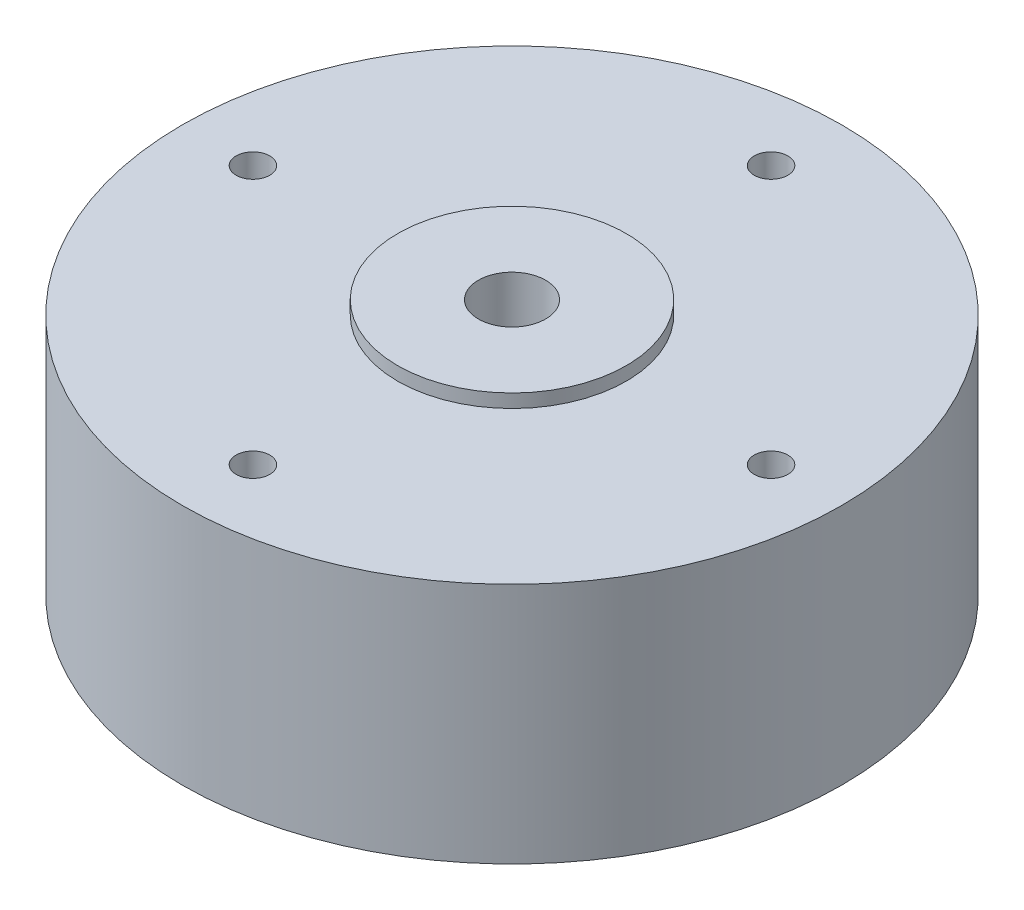
ISO-10303-21;
HEADER;
FILE_DESCRIPTION(('STEP AP214'),'2;1');
FILE_NAME('part.step','',(''),(''),'','','');
FILE_SCHEMA(('AUTOMOTIVE_DESIGN { 1 0 10303 214 1 1 1 1 }'));
ENDSEC;
DATA;
#1=APPLICATION_CONTEXT('core data for automotive mechanical design processes');
#2=APPLICATION_PROTOCOL_DEFINITION('international standard','automotive_design',2000,#1);
#3=PRODUCT_CONTEXT('',#1,'mechanical');
#4=PRODUCT('Part','Part','',(#3));
#5=PRODUCT_RELATED_PRODUCT_CATEGORY('part','',(#4));
#6=PRODUCT_DEFINITION_FORMATION('','',#4);
#7=PRODUCT_DEFINITION_CONTEXT('part definition',#1,'design');
#8=PRODUCT_DEFINITION('design','',#6,#7);
#9=PRODUCT_DEFINITION_SHAPE('','',#8);
#10=(LENGTH_UNIT() NAMED_UNIT(*) SI_UNIT(.MILLI.,.METRE.));
#11=(NAMED_UNIT(*) PLANE_ANGLE_UNIT() SI_UNIT($,.RADIAN.));
#12=(NAMED_UNIT(*) SI_UNIT($,.STERADIAN.) SOLID_ANGLE_UNIT());
#13=UNCERTAINTY_MEASURE_WITH_UNIT(LENGTH_MEASURE(1.E-05),#10,'distance_accuracy_value','');
#14=(GEOMETRIC_REPRESENTATION_CONTEXT(3) GLOBAL_UNCERTAINTY_ASSIGNED_CONTEXT((#13)) GLOBAL_UNIT_ASSIGNED_CONTEXT((#10,
#11,#12)) REPRESENTATION_CONTEXT('',''));
#15=CARTESIAN_POINT('',(0.,0.,0.));
#16=DIRECTION('',(0.,0.,1.));
#17=DIRECTION('',(1.,0.,0.));
#18=AXIS2_PLACEMENT_3D('',#15,#16,#17);
#19=CARTESIAN_POINT('',(0.,19.,0.));
#20=DIRECTION('',(0.,-1.,0.));
#21=DIRECTION('',(0.,0.,-1.));
#22=AXIS2_PLACEMENT_3D('',#19,#20,#21);
#23=CYLINDRICAL_SURFACE('',#22,24.5);
#24=CARTESIAN_POINT('',(0.,0.,0.));
#25=DIRECTION('',(0.,1.,0.));
#26=DIRECTION('',(0.,0.,1.));
#27=AXIS2_PLACEMENT_3D('',#24,#25,#26);
#28=CIRCLE('',#27,24.5);
#29=CARTESIAN_POINT('',(0.,0.,24.5));
#30=VERTEX_POINT('',#29);
#31=EDGE_CURVE('E10',#30,#30,#28,.T.);
#32=ORIENTED_EDGE('',*,*,#31,.T.);
#33=EDGE_LOOP('',(#32));
#34=FACE_BOUND('',#33,.T.);
#35=CARTESIAN_POINT('',(0.,18.,0.));
#36=DIRECTION('',(0.,1.,0.));
#37=DIRECTION('',(0.,0.,1.));
#38=AXIS2_PLACEMENT_3D('',#35,#36,#37);
#39=CIRCLE('',#38,24.5);
#40=CARTESIAN_POINT('',(0.,18.,24.5));
#41=VERTEX_POINT('',#40);
#42=EDGE_CURVE('E39',#41,#41,#39,.T.);
#43=ORIENTED_EDGE('',*,*,#42,.F.);
#44=EDGE_LOOP('',(#43));
#45=FACE_BOUND('',#44,.T.);
#46=ADVANCED_FACE('F32',(#34,#45),#23,.T.);
#47=CARTESIAN_POINT('',(0.,0.,0.));
#48=DIRECTION('',(0.,1.,0.));
#49=DIRECTION('',(0.,0.,1.));
#50=AXIS2_PLACEMENT_3D('',#47,#48,#49);
#51=PLANE('',#50);
#52=CARTESIAN_POINT('',(0.,0.,0.));
#53=DIRECTION('',(0.,-1.,0.));
#54=DIRECTION('',(0.,0.,-1.));
#55=AXIS2_PLACEMENT_3D('',#52,#53,#54);
#56=CIRCLE('',#55,2.5);
#57=CARTESIAN_POINT('',(0.,0.,-2.5));
#58=VERTEX_POINT('',#57);
#59=EDGE_CURVE('E104',#58,#58,#56,.T.);
#60=ORIENTED_EDGE('',*,*,#59,.F.);
#61=EDGE_LOOP('',(#60));
#62=FACE_BOUND('',#61,.T.);
#63=CARTESIAN_POINT('',(0.,0.,12.5));
#64=DIRECTION('',(0.,-1.,0.));
#65=DIRECTION('',(0.,0.,-1.));
#66=AXIS2_PLACEMENT_3D('',#63,#64,#65);
#67=CIRCLE('',#66,1.5);
#68=CARTESIAN_POINT('',(0.,0.,11.));
#69=VERTEX_POINT('',#68);
#70=EDGE_CURVE('E99',#69,#69,#67,.T.);
#71=ORIENTED_EDGE('',*,*,#70,.F.);
#72=EDGE_LOOP('',(#71));
#73=FACE_BOUND('',#72,.T.);
#74=CARTESIAN_POINT('',(12.5,0.,0.));
#75=DIRECTION('',(0.,-1.,0.));
#76=DIRECTION('',(0.,0.,-1.));
#77=AXIS2_PLACEMENT_3D('',#74,#75,#76);
#78=CIRCLE('',#77,1.5);
#79=CARTESIAN_POINT('',(12.5,0.,-1.5));
#80=VERTEX_POINT('',#79);
#81=EDGE_CURVE('E93',#80,#80,#78,.T.);
#82=ORIENTED_EDGE('',*,*,#81,.F.);
#83=EDGE_LOOP('',(#82));
#84=FACE_BOUND('',#83,.T.);
#85=CARTESIAN_POINT('',(0.,0.,-12.5));
#86=DIRECTION('',(0.,-1.,0.));
#87=DIRECTION('',(0.,0.,-1.));
#88=AXIS2_PLACEMENT_3D('',#85,#86,#87);
#89=CIRCLE('',#88,1.5);
#90=CARTESIAN_POINT('',(0.,0.,-14.));
#91=VERTEX_POINT('',#90);
#92=EDGE_CURVE('E87',#91,#91,#89,.T.);
#93=ORIENTED_EDGE('',*,*,#92,.F.);
#94=EDGE_LOOP('',(#93));
#95=FACE_BOUND('',#94,.T.);
#96=CARTESIAN_POINT('',(-12.5,0.,0.));
#97=DIRECTION('',(0.,-1.,0.));
#98=DIRECTION('',(0.,0.,-1.));
#99=AXIS2_PLACEMENT_3D('',#96,#97,#98);
#100=CIRCLE('',#99,1.5);
#101=CARTESIAN_POINT('',(-12.5,0.,-1.5));
#102=VERTEX_POINT('',#101);
#103=EDGE_CURVE('E80',#102,#102,#100,.T.);
#104=ORIENTED_EDGE('',*,*,#103,.F.);
#105=EDGE_LOOP('',(#104));
#106=FACE_BOUND('',#105,.T.);
#107=ORIENTED_EDGE('',*,*,#31,.F.);
#108=EDGE_LOOP('',(#107));
#109=FACE_BOUND('',#108,.T.);
#110=ADVANCED_FACE('F119',(#62,#73,#84,#95,#106,#109),#51,.F.);
#111=CARTESIAN_POINT('',(0.,18.,0.));
#112=DIRECTION('',(0.,1.,0.));
#113=DIRECTION('',(0.,0.,1.));
#114=AXIS2_PLACEMENT_3D('',#111,#112,#113);
#115=PLANE('',#114);
#116=CARTESIAN_POINT('',(0.,18.,-19.25));
#117=DIRECTION('',(0.,1.,0.));
#118=DIRECTION('',(0.,0.,1.));
#119=AXIS2_PLACEMENT_3D('',#116,#117,#118);
#120=CIRCLE('',#119,1.25);
#121=CARTESIAN_POINT('',(0.,18.,-18.));
#122=VERTEX_POINT('',#121);
#123=EDGE_CURVE('E35',#122,#122,#120,.T.);
#124=ORIENTED_EDGE('',*,*,#123,.F.);
#125=EDGE_LOOP('',(#124));
#126=FACE_BOUND('',#125,.T.);
#127=CARTESIAN_POINT('',(19.25,18.,0.));
#128=DIRECTION('',(0.,1.,0.));
#129=DIRECTION('',(0.,0.,1.));
#130=AXIS2_PLACEMENT_3D('',#127,#128,#129);
#131=CIRCLE('',#130,1.25);
#132=CARTESIAN_POINT('',(19.25,18.,1.25));
#133=VERTEX_POINT('',#132);
#134=EDGE_CURVE('E54',#133,#133,#131,.T.);
#135=ORIENTED_EDGE('',*,*,#134,.F.);
#136=EDGE_LOOP('',(#135));
#137=FACE_BOUND('',#136,.T.);
#138=CARTESIAN_POINT('',(0.,18.,19.25));
#139=DIRECTION('',(0.,1.,0.));
#140=DIRECTION('',(0.,0.,1.));
#141=AXIS2_PLACEMENT_3D('',#138,#139,#140);
#142=CIRCLE('',#141,1.25);
#143=CARTESIAN_POINT('',(0.,18.,20.5));
#144=VERTEX_POINT('',#143);
#145=EDGE_CURVE('E51',#144,#144,#142,.T.);
#146=ORIENTED_EDGE('',*,*,#145,.F.);
#147=EDGE_LOOP('',(#146));
#148=FACE_BOUND('',#147,.T.);
#149=CARTESIAN_POINT('',(-19.25,18.,0.));
#150=DIRECTION('',(0.,1.,0.));
#151=DIRECTION('',(0.,0.,1.));
#152=AXIS2_PLACEMENT_3D('',#149,#150,#151);
#153=CIRCLE('',#152,1.25);
#154=CARTESIAN_POINT('',(-19.25,18.,1.25));
#155=VERTEX_POINT('',#154);
#156=EDGE_CURVE('E48',#155,#155,#153,.T.);
#157=ORIENTED_EDGE('',*,*,#156,.F.);
#158=EDGE_LOOP('',(#157));
#159=FACE_BOUND('',#158,.T.);
#160=CARTESIAN_POINT('',(0.,18.,0.));
#161=DIRECTION('',(0.,1.,0.));
#162=DIRECTION('',(0.,0.,1.));
#163=AXIS2_PLACEMENT_3D('',#160,#161,#162);
#164=CIRCLE('',#163,8.5);
#165=CARTESIAN_POINT('',(0.,18.,8.5));
#166=VERTEX_POINT('',#165);
#167=EDGE_CURVE('E44',#166,#166,#164,.T.);
#168=ORIENTED_EDGE('',*,*,#167,.F.);
#169=EDGE_LOOP('',(#168));
#170=FACE_BOUND('',#169,.T.);
#171=ORIENTED_EDGE('',*,*,#42,.T.);
#172=EDGE_LOOP('',(#171));
#173=FACE_BOUND('',#172,.T.);
#174=ADVANCED_FACE('F122',(#126,#137,#148,#159,#170,#173),#115,.T.);
#175=CARTESIAN_POINT('',(0.,18.,0.));
#176=DIRECTION('',(0.,1.,0.));
#177=DIRECTION('',(0.,0.,1.));
#178=AXIS2_PLACEMENT_3D('',#175,#176,#177);
#179=CYLINDRICAL_SURFACE('',#178,8.5);
#180=ORIENTED_EDGE('',*,*,#167,.T.);
#181=EDGE_LOOP('',(#180));
#182=FACE_BOUND('',#181,.T.);
#183=CARTESIAN_POINT('',(0.,19.,0.));
#184=DIRECTION('',(0.,1.,0.));
#185=DIRECTION('',(0.,0.,1.));
#186=AXIS2_PLACEMENT_3D('',#183,#184,#185);
#187=CIRCLE('',#186,8.5);
#188=CARTESIAN_POINT('',(0.,19.,8.5));
#189=VERTEX_POINT('',#188);
#190=EDGE_CURVE('E59',#189,#189,#187,.T.);
#191=ORIENTED_EDGE('',*,*,#190,.F.);
#192=EDGE_LOOP('',(#191));
#193=FACE_BOUND('',#192,.T.);
#194=ADVANCED_FACE('F156',(#182,#193),#179,.T.);
#195=CARTESIAN_POINT('',(0.,19.,0.));
#196=DIRECTION('',(0.,1.,0.));
#197=DIRECTION('',(0.,0.,1.));
#198=AXIS2_PLACEMENT_3D('',#195,#196,#197);
#199=PLANE('',#198);
#200=CARTESIAN_POINT('',(0.,19.,0.));
#201=DIRECTION('',(0.,-1.,0.));
#202=DIRECTION('',(0.,0.,-1.));
#203=AXIS2_PLACEMENT_3D('',#200,#201,#202);
#204=CIRCLE('',#203,2.5);
#205=CARTESIAN_POINT('',(0.,19.,-2.5));
#206=VERTEX_POINT('',#205);
#207=EDGE_CURVE('E84',#206,#206,#204,.T.);
#208=ORIENTED_EDGE('',*,*,#207,.T.);
#209=EDGE_LOOP('',(#208));
#210=FACE_BOUND('',#209,.T.);
#211=ORIENTED_EDGE('',*,*,#190,.T.);
#212=EDGE_LOOP('',(#211));
#213=FACE_BOUND('',#212,.T.);
#214=ADVANCED_FACE('F110',(#210,#213),#199,.T.);
#215=CARTESIAN_POINT('',(-19.25,15.,0.));
#216=DIRECTION('',(0.,1.,0.));
#217=DIRECTION('',(0.,0.,1.));
#218=AXIS2_PLACEMENT_3D('',#215,#216,#217);
#219=CYLINDRICAL_SURFACE('',#218,1.25);
#220=ORIENTED_EDGE('',*,*,#156,.T.);
#221=EDGE_LOOP('',(#220));
#222=FACE_BOUND('',#221,.T.);
#223=CARTESIAN_POINT('',(-19.25,15.,0.));
#224=DIRECTION('',(0.,1.,0.));
#225=DIRECTION('',(0.,0.,1.));
#226=AXIS2_PLACEMENT_3D('',#223,#224,#225);
#227=CIRCLE('',#226,1.25);
#228=CARTESIAN_POINT('',(-19.25,15.,1.25));
#229=VERTEX_POINT('',#228);
#230=EDGE_CURVE('E68',#229,#229,#227,.T.);
#231=ORIENTED_EDGE('',*,*,#230,.F.);
#232=EDGE_LOOP('',(#231));
#233=FACE_BOUND('',#232,.T.);
#234=ADVANCED_FACE('F168',(#222,#233),#219,.F.);
#235=CARTESIAN_POINT('',(-19.25,15.,0.));
#236=DIRECTION('',(0.,1.,0.));
#237=DIRECTION('',(0.,0.,1.));
#238=AXIS2_PLACEMENT_3D('',#235,#236,#237);
#239=PLANE('',#238);
#240=ORIENTED_EDGE('',*,*,#230,.T.);
#241=EDGE_LOOP('',(#240));
#242=FACE_BOUND('',#241,.T.);
#243=ADVANCED_FACE('F172',(#242),#239,.T.);
#244=CARTESIAN_POINT('',(0.,15.,19.25));
#245=DIRECTION('',(0.,1.,0.));
#246=DIRECTION('',(0.,0.,1.));
#247=AXIS2_PLACEMENT_3D('',#244,#245,#246);
#248=CYLINDRICAL_SURFACE('',#247,1.25);
#249=ORIENTED_EDGE('',*,*,#145,.T.);
#250=EDGE_LOOP('',(#249));
#251=FACE_BOUND('',#250,.T.);
#252=CARTESIAN_POINT('',(0.,15.,19.25));
#253=DIRECTION('',(0.,1.,0.));
#254=DIRECTION('',(0.,0.,1.));
#255=AXIS2_PLACEMENT_3D('',#252,#253,#254);
#256=CIRCLE('',#255,1.25);
#257=CARTESIAN_POINT('',(0.,15.,20.5));
#258=VERTEX_POINT('',#257);
#259=EDGE_CURVE('E71',#258,#258,#256,.T.);
#260=ORIENTED_EDGE('',*,*,#259,.F.);
#261=EDGE_LOOP('',(#260));
#262=FACE_BOUND('',#261,.T.);
#263=ADVANCED_FACE('F177',(#251,#262),#248,.F.);
#264=CARTESIAN_POINT('',(0.,15.,19.25));
#265=DIRECTION('',(0.,1.,0.));
#266=DIRECTION('',(0.,0.,1.));
#267=AXIS2_PLACEMENT_3D('',#264,#265,#266);
#268=PLANE('',#267);
#269=ORIENTED_EDGE('',*,*,#259,.T.);
#270=EDGE_LOOP('',(#269));
#271=FACE_BOUND('',#270,.T.);
#272=ADVANCED_FACE('F184',(#271),#268,.T.);
#273=CARTESIAN_POINT('',(19.25,15.,0.));
#274=DIRECTION('',(0.,1.,0.));
#275=DIRECTION('',(0.,0.,1.));
#276=AXIS2_PLACEMENT_3D('',#273,#274,#275);
#277=CYLINDRICAL_SURFACE('',#276,1.25);
#278=ORIENTED_EDGE('',*,*,#134,.T.);
#279=EDGE_LOOP('',(#278));
#280=FACE_BOUND('',#279,.T.);
#281=CARTESIAN_POINT('',(19.25,15.,0.));
#282=DIRECTION('',(0.,1.,0.));
#283=DIRECTION('',(0.,0.,1.));
#284=AXIS2_PLACEMENT_3D('',#281,#282,#283);
#285=CIRCLE('',#284,1.25);
#286=CARTESIAN_POINT('',(19.25,15.,1.25));
#287=VERTEX_POINT('',#286);
#288=EDGE_CURVE('E75',#287,#287,#285,.T.);
#289=ORIENTED_EDGE('',*,*,#288,.F.);
#290=EDGE_LOOP('',(#289));
#291=FACE_BOUND('',#290,.T.);
#292=ADVANCED_FACE('F188',(#280,#291),#277,.F.);
#293=CARTESIAN_POINT('',(19.25,15.,0.));
#294=DIRECTION('',(0.,1.,0.));
#295=DIRECTION('',(0.,0.,1.));
#296=AXIS2_PLACEMENT_3D('',#293,#294,#295);
#297=PLANE('',#296);
#298=ORIENTED_EDGE('',*,*,#288,.T.);
#299=EDGE_LOOP('',(#298));
#300=FACE_BOUND('',#299,.T.);
#301=ADVANCED_FACE('F192',(#300),#297,.T.);
#302=CARTESIAN_POINT('',(0.,15.,-19.25));
#303=DIRECTION('',(0.,1.,0.));
#304=DIRECTION('',(0.,0.,1.));
#305=AXIS2_PLACEMENT_3D('',#302,#303,#304);
#306=CYLINDRICAL_SURFACE('',#305,1.25);
#307=ORIENTED_EDGE('',*,*,#123,.T.);
#308=EDGE_LOOP('',(#307));
#309=FACE_BOUND('',#308,.T.);
#310=CARTESIAN_POINT('',(0.,15.,-19.25));
#311=DIRECTION('',(0.,1.,0.));
#312=DIRECTION('',(0.,0.,1.));
#313=AXIS2_PLACEMENT_3D('',#310,#311,#312);
#314=CIRCLE('',#313,1.25);
#315=CARTESIAN_POINT('',(0.,15.,-18.));
#316=VERTEX_POINT('',#315);
#317=EDGE_CURVE('E52',#316,#316,#314,.T.);
#318=ORIENTED_EDGE('',*,*,#317,.F.);
#319=EDGE_LOOP('',(#318));
#320=FACE_BOUND('',#319,.T.);
#321=ADVANCED_FACE('F145',(#309,#320),#306,.F.);
#322=CARTESIAN_POINT('',(0.,15.,-19.25));
#323=DIRECTION('',(0.,1.,0.));
#324=DIRECTION('',(0.,0.,1.));
#325=AXIS2_PLACEMENT_3D('',#322,#323,#324);
#326=PLANE('',#325);
#327=ORIENTED_EDGE('',*,*,#317,.T.);
#328=EDGE_LOOP('',(#327));
#329=FACE_BOUND('',#328,.T.);
#330=ADVANCED_FACE('F135',(#329),#326,.T.);
#331=CARTESIAN_POINT('',(-12.5,3.,0.));
#332=DIRECTION('',(0.,-1.,0.));
#333=DIRECTION('',(0.,0.,-1.));
#334=AXIS2_PLACEMENT_3D('',#331,#332,#333);
#335=CYLINDRICAL_SURFACE('',#334,1.5);
#336=CARTESIAN_POINT('',(-12.5,3.,0.));
#337=DIRECTION('',(0.,-1.,0.));
#338=DIRECTION('',(0.,0.,-1.));
#339=AXIS2_PLACEMENT_3D('',#336,#337,#338);
#340=CIRCLE('',#339,1.5);
#341=CARTESIAN_POINT('',(-12.5,3.,-1.5));
#342=VERTEX_POINT('',#341);
#343=EDGE_CURVE('E83',#342,#342,#340,.T.);
#344=ORIENTED_EDGE('',*,*,#343,.F.);
#345=EDGE_LOOP('',(#344));
#346=FACE_BOUND('',#345,.T.);
#347=ORIENTED_EDGE('',*,*,#103,.T.);
#348=EDGE_LOOP('',(#347));
#349=FACE_BOUND('',#348,.T.);
#350=ADVANCED_FACE('F132',(#346,#349),#335,.F.);
#351=CARTESIAN_POINT('',(-12.5,3.,0.));
#352=DIRECTION('',(0.,-1.,0.));
#353=DIRECTION('',(0.,0.,-1.));
#354=AXIS2_PLACEMENT_3D('',#351,#352,#353);
#355=PLANE('',#354);
#356=ORIENTED_EDGE('',*,*,#343,.T.);
#357=EDGE_LOOP('',(#356));
#358=FACE_BOUND('',#357,.T.);
#359=ADVANCED_FACE('F134',(#358),#355,.T.);
#360=CARTESIAN_POINT('',(0.,3.,-12.5));
#361=DIRECTION('',(0.,-1.,0.));
#362=DIRECTION('',(0.,0.,-1.));
#363=AXIS2_PLACEMENT_3D('',#360,#361,#362);
#364=CYLINDRICAL_SURFACE('',#363,1.5);
#365=CARTESIAN_POINT('',(0.,3.,-12.5));
#366=DIRECTION('',(0.,-1.,0.));
#367=DIRECTION('',(0.,0.,-1.));
#368=AXIS2_PLACEMENT_3D('',#365,#366,#367);
#369=CIRCLE('',#368,1.5);
#370=CARTESIAN_POINT('',(0.,3.,-14.));
#371=VERTEX_POINT('',#370);
#372=EDGE_CURVE('E90',#371,#371,#369,.T.);
#373=ORIENTED_EDGE('',*,*,#372,.F.);
#374=EDGE_LOOP('',(#373));
#375=FACE_BOUND('',#374,.T.);
#376=ORIENTED_EDGE('',*,*,#92,.T.);
#377=EDGE_LOOP('',(#376));
#378=FACE_BOUND('',#377,.T.);
#379=ADVANCED_FACE('F142',(#375,#378),#364,.F.);
#380=CARTESIAN_POINT('',(0.,3.,-12.5));
#381=DIRECTION('',(0.,-1.,0.));
#382=DIRECTION('',(0.,0.,-1.));
#383=AXIS2_PLACEMENT_3D('',#380,#381,#382);
#384=PLANE('',#383);
#385=ORIENTED_EDGE('',*,*,#372,.T.);
#386=EDGE_LOOP('',(#385));
#387=FACE_BOUND('',#386,.T.);
#388=ADVANCED_FACE('F226',(#387),#384,.T.);
#389=CARTESIAN_POINT('',(12.5,3.,0.));
#390=DIRECTION('',(0.,-1.,0.));
#391=DIRECTION('',(0.,0.,-1.));
#392=AXIS2_PLACEMENT_3D('',#389,#390,#391);
#393=CYLINDRICAL_SURFACE('',#392,1.5);
#394=CARTESIAN_POINT('',(12.5,3.,0.));
#395=DIRECTION('',(0.,-1.,0.));
#396=DIRECTION('',(0.,0.,-1.));
#397=AXIS2_PLACEMENT_3D('',#394,#395,#396);
#398=CIRCLE('',#397,1.5);
#399=CARTESIAN_POINT('',(12.5,3.,-1.5));
#400=VERTEX_POINT('',#399);
#401=EDGE_CURVE('E96',#400,#400,#398,.T.);
#402=ORIENTED_EDGE('',*,*,#401,.F.);
#403=EDGE_LOOP('',(#402));
#404=FACE_BOUND('',#403,.T.);
#405=ORIENTED_EDGE('',*,*,#81,.T.);
#406=EDGE_LOOP('',(#405));
#407=FACE_BOUND('',#406,.T.);
#408=ADVANCED_FACE('F236',(#404,#407),#393,.F.);
#409=CARTESIAN_POINT('',(12.5,3.,0.));
#410=DIRECTION('',(0.,-1.,0.));
#411=DIRECTION('',(0.,0.,-1.));
#412=AXIS2_PLACEMENT_3D('',#409,#410,#411);
#413=PLANE('',#412);
#414=ORIENTED_EDGE('',*,*,#401,.T.);
#415=EDGE_LOOP('',(#414));
#416=FACE_BOUND('',#415,.T.);
#417=ADVANCED_FACE('F246',(#416),#413,.T.);
#418=CARTESIAN_POINT('',(0.,3.,12.5));
#419=DIRECTION('',(0.,-1.,0.));
#420=DIRECTION('',(0.,0.,-1.));
#421=AXIS2_PLACEMENT_3D('',#418,#419,#420);
#422=CYLINDRICAL_SURFACE('',#421,1.5);
#423=CARTESIAN_POINT('',(0.,3.,12.5));
#424=DIRECTION('',(0.,-1.,0.));
#425=DIRECTION('',(0.,0.,-1.));
#426=AXIS2_PLACEMENT_3D('',#423,#424,#425);
#427=CIRCLE('',#426,1.5);
#428=CARTESIAN_POINT('',(0.,3.,11.));
#429=VERTEX_POINT('',#428);
#430=EDGE_CURVE('E72',#429,#429,#427,.T.);
#431=ORIENTED_EDGE('',*,*,#430,.F.);
#432=EDGE_LOOP('',(#431));
#433=FACE_BOUND('',#432,.T.);
#434=ORIENTED_EDGE('',*,*,#70,.T.);
#435=EDGE_LOOP('',(#434));
#436=FACE_BOUND('',#435,.T.);
#437=ADVANCED_FACE('F256',(#433,#436),#422,.F.);
#438=CARTESIAN_POINT('',(0.,3.,12.5));
#439=DIRECTION('',(0.,-1.,0.));
#440=DIRECTION('',(0.,0.,-1.));
#441=AXIS2_PLACEMENT_3D('',#438,#439,#440);
#442=PLANE('',#441);
#443=ORIENTED_EDGE('',*,*,#430,.T.);
#444=EDGE_LOOP('',(#443));
#445=FACE_BOUND('',#444,.T.);
#446=ADVANCED_FACE('F115',(#445),#442,.T.);
#447=CARTESIAN_POINT('',(0.,19.,0.));
#448=DIRECTION('',(0.,-1.,0.));
#449=DIRECTION('',(0.,0.,-1.));
#450=AXIS2_PLACEMENT_3D('',#447,#448,#449);
#451=CYLINDRICAL_SURFACE('',#450,2.5);
#452=ORIENTED_EDGE('',*,*,#207,.F.);
#453=EDGE_LOOP('',(#452));
#454=FACE_BOUND('',#453,.T.);
#455=ORIENTED_EDGE('',*,*,#59,.T.);
#456=EDGE_LOOP('',(#455));
#457=FACE_BOUND('',#456,.T.);
#458=ADVANCED_FACE('F112',(#454,#457),#451,.F.);
#459=CLOSED_SHELL('',(#46,#110,#174,#194,#214,#234,#243,#263,#272,#292,#301,#321,#330,#350,#359,
#379,#388,#408,#417,#437,#446,#458));
#460=MANIFOLD_SOLID_BREP('B2',#459);
#461=ADVANCED_BREP_SHAPE_REPRESENTATION('',(#18,#460),#14);
#462=SHAPE_DEFINITION_REPRESENTATION(#9,#461);
ENDSEC;
END-ISO-10303-21;
